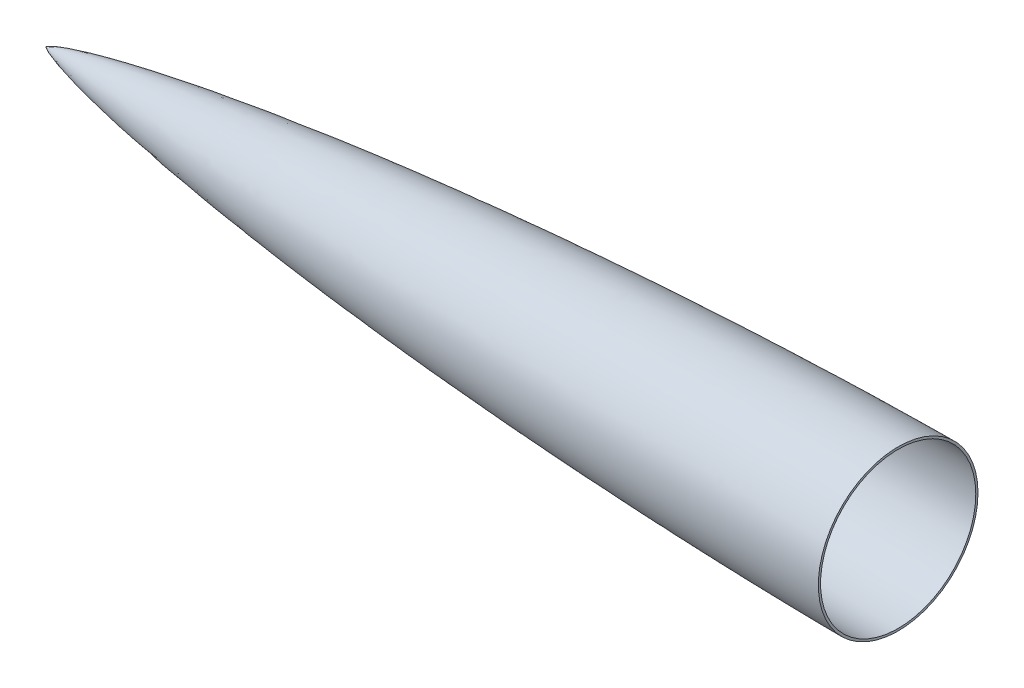
ISO-10303-21;
HEADER;
FILE_DESCRIPTION(('STEP AP214'),'2;1');
FILE_NAME('part.step','',(''),(''),'','','');
FILE_SCHEMA(('AUTOMOTIVE_DESIGN { 1 0 10303 214 1 1 1 1 }'));
ENDSEC;
DATA;
#1=APPLICATION_CONTEXT('core data for automotive mechanical design processes');
#2=APPLICATION_PROTOCOL_DEFINITION('international standard','automotive_design',2000,#1);
#3=PRODUCT_CONTEXT('',#1,'mechanical');
#4=PRODUCT('Part','Part','',(#3));
#5=PRODUCT_RELATED_PRODUCT_CATEGORY('part','',(#4));
#6=PRODUCT_DEFINITION_FORMATION('','',#4);
#7=PRODUCT_DEFINITION_CONTEXT('part definition',#1,'design');
#8=PRODUCT_DEFINITION('design','',#6,#7);
#9=PRODUCT_DEFINITION_SHAPE('','',#8);
#10=(LENGTH_UNIT() NAMED_UNIT(*) SI_UNIT(.MILLI.,.METRE.));
#11=(NAMED_UNIT(*) PLANE_ANGLE_UNIT() SI_UNIT($,.RADIAN.));
#12=(NAMED_UNIT(*) SI_UNIT($,.STERADIAN.) SOLID_ANGLE_UNIT());
#13=UNCERTAINTY_MEASURE_WITH_UNIT(LENGTH_MEASURE(1.E-05),#10,'distance_accuracy_value','');
#14=(GEOMETRIC_REPRESENTATION_CONTEXT(3) GLOBAL_UNCERTAINTY_ASSIGNED_CONTEXT((#13)) GLOBAL_UNIT_ASSIGNED_CONTEXT((#10,
#11,#12)) REPRESENTATION_CONTEXT('',''));
#15=CARTESIAN_POINT('',(0.,0.,0.));
#16=DIRECTION('',(0.,0.,1.));
#17=DIRECTION('',(1.,0.,0.));
#18=AXIS2_PLACEMENT_3D('',#15,#16,#17);
#19=CARTESIAN_POINT('',(838.,0.,-78.5));
#20=CARTESIAN_POINT('',(834.787449400506,0.,-78.4958947694908));
#21=CARTESIAN_POINT('',(828.362407194351,0.,-78.4648052716793));
#22=CARTESIAN_POINT('',(815.512567408867,0.,-78.3648876672273));
#23=CARTESIAN_POINT('',(796.133023755242,0.,-78.1303162092806));
#24=CARTESIAN_POINT('',(773.436916118335,0.,-77.7602882049747));
#25=CARTESIAN_POINT('',(740.89596858801,0.,-77.083103672316));
#26=CARTESIAN_POINT('',(701.725225440461,0.,-76.0471629168104));
#27=CARTESIAN_POINT('',(656.03501329108,0.,-74.5309163669196));
#28=CARTESIAN_POINT('',(603.833193293034,0.,-72.3793641887504));
#29=CARTESIAN_POINT('',(551.650632791448,0.,-69.8020881862025));
#30=CARTESIAN_POINT('',(499.491583242073,0.,-66.7853071741648));
#31=CARTESIAN_POINT('',(447.361077013539,0.,-63.3090705654979));
#32=CARTESIAN_POINT('',(395.265156805375,0.,-59.3467435055695));
#33=CARTESIAN_POINT('',(343.211420132115,0.,-54.8627429871796));
#34=CARTESIAN_POINT('',(291.209622759579,0.,-49.8095731592467));
#35=CARTESIAN_POINT('',(239.27325584452,0.,-44.1205115053254));
#36=CARTESIAN_POINT('',(187.421711035797,0.,-37.6991839837303));
#37=CARTESIAN_POINT('',(142.817093891182,0.,-31.398603344231));
#38=CARTESIAN_POINT('',(105.445457278386,0.,-25.4223193697081));
#39=CARTESIAN_POINT('',(74.6259359562451,0.,-19.8758289736833));
#40=CARTESIAN_POINT('',(52.5671970441152,0.,-15.4747461222976));
#41=CARTESIAN_POINT('',(33.9609192056597,0.,-11.2837747832841));
#42=CARTESIAN_POINT('',(19.882408875045,0.,-7.60080374748125));
#43=CARTESIAN_POINT('',(11.458236531171,0.,-5.04092147328415));
#44=CARTESIAN_POINT('',(6.72582447178326,0.,-3.38253884769102));
#45=CARTESIAN_POINT('',(4.09195035364413,0.,-2.32977191767579));
#46=CARTESIAN_POINT('',(2.56805736593401,0.,-1.64147860774937));
#47=CARTESIAN_POINT('',(1.71896388694308,0.,-1.21269065632431));
#48=CARTESIAN_POINT('',(1.2262533902569,0.,-0.939766833727169));
#49=CARTESIAN_POINT('',(0.85963427630338,0.,-0.720511774130705));
#50=CARTESIAN_POINT('',(0.619123211683576,0.,-0.564975524996162));
#51=CARTESIAN_POINT('',(0.407875383512483,0.,-0.415110114366565));
#52=CARTESIAN_POINT('',(0.229053965375454,0.,-0.268473421836138));
#53=CARTESIAN_POINT('',(0.137310021899744,0.,-0.184120385481693));
#54=CARTESIAN_POINT('',(0.0703789741836745,0.,-0.112607503244455));
#55=CARTESIAN_POINT('',(0.0271034752361242,0.,-0.055894621065574));
#56=CARTESIAN_POINT('',(0.00902846012578188,0.,-0.0251544181752423));
#57=CARTESIAN_POINT('',(0.00260601068415885,0.,-0.00857461351478238));
#58=CARTESIAN_POINT('',(0.,0.,0.));
#59=B_SPLINE_CURVE_WITH_KNOTS('',4,(#19,#20,#21,#22,#23,#24,#25,#26,#27,#28,#29,#30,#31,#32,#33,
#34,#35,#36,#37,#38,#39,#40,#41,#42,#43,#44,#45,#46,#47,#48,#49,#50,#51,#52,#53,#54,#55,#56,#57,
#58),.UNSPECIFIED.,.F.,.F.,(5,1,1,1,1,1,1,1,1,1,1,1,1,1,1,1,1,1,1,1,1,1,1,1,1,1,1,1,1,1,1,1,1,1,
1,1,5),(0.,0.0152265682715702,0.0304531365431403,0.0609062730862806,0.091859903849248,
0.122813534612215,0.184720795846757,0.246628057087855,0.308535319037777,0.370442579621299,
0.432349840954392,0.494257103248812,0.55616436368413,0.618071624151857,0.679978884804481,
0.741886145225062,0.803793405134469,0.8657006682975,0.893478072212151,0.921255476126801,
0.952209101588318,0.972305744849894,0.983861034963458,0.990213786706322,0.993929026654059,
0.996066630463778,0.997301023972167,0.998136774779948,0.998436248399732,0.998735722019515,
0.999325462649465,0.999494096987099,0.999662731324732,0.999831365662366,0.999915682831183,
0.999957841415592,1.),.UNSPECIFIED.);
#60=CARTESIAN_POINT('',(838.,0.,0.));
#61=DIRECTION('',(1.,0.,0.));
#62=AXIS1_PLACEMENT('',#60,#61);
#63=SURFACE_OF_REVOLUTION('',#59,#62);
#64=CARTESIAN_POINT('',(0.,0.,0.));
#65=VERTEX_POINT('',#64);
#66=VERTEX_LOOP('',#65);
#67=FACE_BOUND('',#66,.T.);
#68=CARTESIAN_POINT('',(838.,0.,0.));
#69=DIRECTION('',(1.,0.,0.));
#70=DIRECTION('',(0.,0.,-1.));
#71=AXIS2_PLACEMENT_3D('',#68,#69,#70);
#72=CIRCLE('',#71,78.5);
#73=CARTESIAN_POINT('',(838.,0.,-78.5));
#74=VERTEX_POINT('',#73);
#75=EDGE_CURVE('E11',#74,#74,#72,.T.);
#76=ORIENTED_EDGE('',*,*,#75,.F.);
#77=EDGE_LOOP('',(#76));
#78=FACE_BOUND('',#77,.T.);
#79=ADVANCED_FACE('F43',(#67,#78),#63,.F.);
#80=CARTESIAN_POINT('',(838.,0.,-78.5));
#81=DIRECTION('',(1.,0.,0.));
#82=DIRECTION('',(0.,0.,-1.));
#83=AXIS2_PLACEMENT_3D('',#80,#81,#82);
#84=PLANE('',#83);
#85=CARTESIAN_POINT('',(837.999999999999,0.,0.));
#86=DIRECTION('',(1.,0.,0.));
#87=DIRECTION('',(0.,0.,-1.));
#88=AXIS2_PLACEMENT_3D('',#85,#86,#87);
#89=CIRCLE('',#88,76.3199982168447);
#90=CARTESIAN_POINT('',(837.999999999999,0.,-76.3199982168447));
#91=VERTEX_POINT('',#90);
#92=EDGE_CURVE('E50',#91,#91,#89,.T.);
#93=ORIENTED_EDGE('',*,*,#92,.F.);
#94=EDGE_LOOP('',(#93));
#95=FACE_BOUND('',#94,.T.);
#96=ORIENTED_EDGE('',*,*,#75,.T.);
#97=EDGE_LOOP('',(#96));
#98=FACE_BOUND('',#97,.T.);
#99=ADVANCED_FACE('F59',(#95,#98),#84,.T.);
#100=CARTESIAN_POINT('',(838.,0.,-78.5));
#101=CARTESIAN_POINT('',(834.787449400506,0.,-78.4958947694908));
#102=CARTESIAN_POINT('',(828.362407194351,0.,-78.4648052716793));
#103=CARTESIAN_POINT('',(815.512567408867,0.,-78.3648876672273));
#104=CARTESIAN_POINT('',(796.133023755242,0.,-78.1303162092806));
#105=CARTESIAN_POINT('',(773.436916118335,0.,-77.7602882049747));
#106=CARTESIAN_POINT('',(740.89596858801,0.,-77.083103672316));
#107=CARTESIAN_POINT('',(701.725225440461,0.,-76.0471629168104));
#108=CARTESIAN_POINT('',(656.03501329108,0.,-74.5309163669196));
#109=CARTESIAN_POINT('',(603.833193293034,0.,-72.3793641887504));
#110=CARTESIAN_POINT('',(551.650632791448,0.,-69.8020881862025));
#111=CARTESIAN_POINT('',(499.491583242073,0.,-66.7853071741648));
#112=CARTESIAN_POINT('',(447.361077013539,0.,-63.3090705654979));
#113=CARTESIAN_POINT('',(395.265156805375,0.,-59.3467435055695));
#114=CARTESIAN_POINT('',(343.211420132115,0.,-54.8627429871796));
#115=CARTESIAN_POINT('',(291.209622759579,0.,-49.8095731592467));
#116=CARTESIAN_POINT('',(239.27325584452,0.,-44.1205115053254));
#117=CARTESIAN_POINT('',(187.421711035797,0.,-37.6991839837303));
#118=CARTESIAN_POINT('',(142.817093891182,0.,-31.398603344231));
#119=CARTESIAN_POINT('',(105.445457278386,0.,-25.4223193697081));
#120=CARTESIAN_POINT('',(74.6259359562451,0.,-19.8758289736833));
#121=CARTESIAN_POINT('',(52.5671970441152,0.,-15.4747461222976));
#122=CARTESIAN_POINT('',(33.9609192056597,0.,-11.2837747832841));
#123=CARTESIAN_POINT('',(19.882408875045,0.,-7.60080374748125));
#124=CARTESIAN_POINT('',(11.458236531171,0.,-5.04092147328415));
#125=CARTESIAN_POINT('',(6.87188942037922,0.,-3.43372449465495));
#126=CARTESIAN_POINT('',(4.62144216457469,0.,-2.54097886285494));
#127=CARTESIAN_POINT('',(3.62979898441079,0.,-2.1126644642871));
#128=CARTESIAN_POINT('',(3.35901942166372,0.,-1.99243871445479));
#129=B_SPLINE_CURVE_WITH_KNOTS('',4,(#100,#101,#102,#103,#104,#105,#106,#107,#108,#109,#110,
#111,#112,#113,#114,#115,#116,#117,#118,#119,#120,#121,#122,#123,#124,#125,#126,#127,#128),
.UNSPECIFIED.,.F.,.F.,(5,1,1,1,1,1,1,1,1,1,1,1,1,1,1,1,1,1,1,1,1,1,1,1,1,5),(0.,
0.0152265682715702,0.0304531365431403,0.0609062730862806,0.091859903849248,0.122813534612215,
0.184720795846757,0.246628057087855,0.308535319037777,0.370442579621299,0.432349840954392,
0.494257103248812,0.55616436368413,0.618071624151857,0.679978884804481,0.741886145225062,
0.803793405134469,0.8657006682975,0.893478072212151,0.921255476126801,0.952209101588318,
0.972305744849894,0.983861034963458,0.990213786706322,0.993929026654059,0.995333255497221),.UNSPECIFIED.);
#130=CARTESIAN_POINT('',(838.,0.,0.));
#131=DIRECTION('',(1.,0.,0.));
#132=AXIS1_PLACEMENT('',#130,#131);
#133=SURFACE_OF_REVOLUTION('',#129,#132);
#134=OFFSET_SURFACE('',#133,2.18,.F.);
#135=CARTESIAN_POINT('',(4.24365944401282,0.,0.));
#136=VERTEX_POINT('',#135);
#137=VERTEX_LOOP('',#136);
#138=FACE_BOUND('',#137,.T.);
#139=ORIENTED_EDGE('',*,*,#92,.T.);
#140=EDGE_LOOP('',(#139));
#141=FACE_BOUND('',#140,.T.);
#142=ADVANCED_FACE('F56',(#138,#141),#134,.T.);
#143=CLOSED_SHELL('',(#79,#99,#142));
#144=MANIFOLD_SOLID_BREP('B2',#143);
#145=ADVANCED_BREP_SHAPE_REPRESENTATION('',(#18,#144),#14);
#146=SHAPE_DEFINITION_REPRESENTATION(#9,#145);
ENDSEC;
END-ISO-10303-21;
